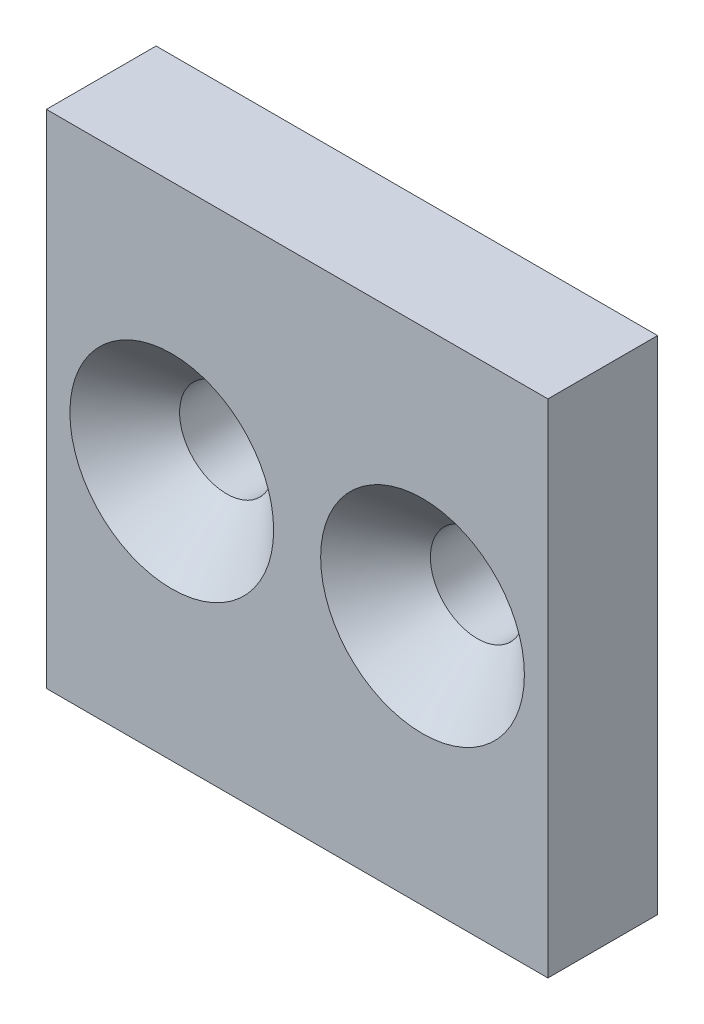
ISO-10303-21;
HEADER;
FILE_DESCRIPTION(('STEP AP214'),'2;1');
FILE_NAME('part.step','',(''),(''),'','','');
FILE_SCHEMA(('AUTOMOTIVE_DESIGN { 1 0 10303 214 1 1 1 1 }'));
ENDSEC;
DATA;
#1=APPLICATION_CONTEXT('core data for automotive mechanical design processes');
#2=APPLICATION_PROTOCOL_DEFINITION('international standard','automotive_design',2000,#1);
#3=PRODUCT_CONTEXT('',#1,'mechanical');
#4=PRODUCT('Part','Part','',(#3));
#5=PRODUCT_RELATED_PRODUCT_CATEGORY('part','',(#4));
#6=PRODUCT_DEFINITION_FORMATION('','',#4);
#7=PRODUCT_DEFINITION_CONTEXT('part definition',#1,'design');
#8=PRODUCT_DEFINITION('design','',#6,#7);
#9=PRODUCT_DEFINITION_SHAPE('','',#8);
#10=(LENGTH_UNIT() NAMED_UNIT(*) SI_UNIT(.MILLI.,.METRE.));
#11=(NAMED_UNIT(*) PLANE_ANGLE_UNIT() SI_UNIT($,.RADIAN.));
#12=(NAMED_UNIT(*) SI_UNIT($,.STERADIAN.) SOLID_ANGLE_UNIT());
#13=UNCERTAINTY_MEASURE_WITH_UNIT(LENGTH_MEASURE(1.E-05),#10,'distance_accuracy_value','');
#14=(GEOMETRIC_REPRESENTATION_CONTEXT(3) GLOBAL_UNCERTAINTY_ASSIGNED_CONTEXT((#13)) GLOBAL_UNIT_ASSIGNED_CONTEXT((#10,
#11,#12)) REPRESENTATION_CONTEXT('',''));
#15=CARTESIAN_POINT('',(0.,0.,0.));
#16=DIRECTION('',(0.,0.,1.));
#17=DIRECTION('',(1.,0.,0.));
#18=AXIS2_PLACEMENT_3D('',#15,#16,#17);
#19=CARTESIAN_POINT('',(22.8801756645573,4.7559127950948,7.));
#20=DIRECTION('',(1.,0.,0.));
#21=DIRECTION('',(0.,1.,0.));
#22=AXIS2_PLACEMENT_3D('',#19,#20,#21);
#23=PLANE('',#22);
#24=DIRECTION('',(0.,-1.,0.));
#25=VECTOR('',#24,1.);
#26=CARTESIAN_POINT('',(22.8801756645573,4.7559127950948,0.));
#27=LINE('',#26,#25);
#28=CARTESIAN_POINT('',(22.8801756645573,4.7559127950948,0.));
#29=VERTEX_POINT('',#28);
#30=CARTESIAN_POINT('',(22.8801756645573,-27.244087204905,0.));
#31=VERTEX_POINT('',#30);
#32=EDGE_CURVE('E105',#29,#31,#27,.T.);
#33=ORIENTED_EDGE('',*,*,#32,.T.);
#34=DIRECTION('',(0.,0.,-1.));
#35=VECTOR('',#34,1.);
#36=CARTESIAN_POINT('',(22.8801756645573,-27.2440872049052,7.00000000000003));
#37=LINE('',#36,#35);
#38=CARTESIAN_POINT('',(22.8801756645573,-27.2440872049052,7.00000000000003));
#39=VERTEX_POINT('',#38);
#40=EDGE_CURVE('E11',#39,#31,#37,.T.);
#41=ORIENTED_EDGE('',*,*,#40,.F.);
#42=DIRECTION('',(0.,-1.,0.));
#43=VECTOR('',#42,1.);
#44=CARTESIAN_POINT('',(22.8801756645573,4.7559127950948,7.));
#45=LINE('',#44,#43);
#46=CARTESIAN_POINT('',(22.8801756645573,4.7559127950948,7.));
#47=VERTEX_POINT('',#46);
#48=EDGE_CURVE('E92',#47,#39,#45,.T.);
#49=ORIENTED_EDGE('',*,*,#48,.F.);
#50=DIRECTION('',(0.,0.,-1.));
#51=VECTOR('',#50,1.);
#52=CARTESIAN_POINT('',(22.8801756645573,4.7559127950948,7.));
#53=LINE('',#52,#51);
#54=EDGE_CURVE('E101',#47,#29,#53,.T.);
#55=ORIENTED_EDGE('',*,*,#54,.T.);
#56=EDGE_LOOP('',(#33,#41,#49,#55));
#57=FACE_BOUND('',#56,.T.);
#58=ADVANCED_FACE('F39',(#57),#23,.F.);
#59=CARTESIAN_POINT('',(22.8801756645573,-27.2440872049052,7.00000000000003));
#60=DIRECTION('',(0.,1.,0.));
#61=DIRECTION('',(0.,0.,1.));
#62=AXIS2_PLACEMENT_3D('',#59,#60,#61);
#63=PLANE('',#62);
#64=DIRECTION('',(1.,0.,0.));
#65=VECTOR('',#64,1.);
#66=CARTESIAN_POINT('',(22.8801756645573,-27.244087204905,0.));
#67=LINE('',#66,#65);
#68=CARTESIAN_POINT('',(54.8801756645573,-27.244087204905,0.));
#69=VERTEX_POINT('',#68);
#70=EDGE_CURVE('E96',#31,#69,#67,.T.);
#71=ORIENTED_EDGE('',*,*,#70,.T.);
#72=DIRECTION('',(0.,0.,-1.));
#73=VECTOR('',#72,1.);
#74=CARTESIAN_POINT('',(54.8801756645573,-27.2440872049052,7.00000000000003));
#75=LINE('',#74,#73);
#76=CARTESIAN_POINT('',(54.8801756645573,-27.2440872049052,7.00000000000003));
#77=VERTEX_POINT('',#76);
#78=EDGE_CURVE('E48',#77,#69,#75,.T.);
#79=ORIENTED_EDGE('',*,*,#78,.F.);
#80=DIRECTION('',(1.,0.,0.));
#81=VECTOR('',#80,1.);
#82=CARTESIAN_POINT('',(22.8801756645573,-27.2440872049052,7.00000000000003));
#83=LINE('',#82,#81);
#84=EDGE_CURVE('E87',#39,#77,#83,.T.);
#85=ORIENTED_EDGE('',*,*,#84,.F.);
#86=ORIENTED_EDGE('',*,*,#40,.T.);
#87=EDGE_LOOP('',(#71,#79,#85,#86));
#88=FACE_BOUND('',#87,.T.);
#89=ADVANCED_FACE('F95',(#88),#63,.F.);
#90=CARTESIAN_POINT('',(54.8801756645573,4.7559127950948,7.));
#91=DIRECTION('',(-1.,0.,0.));
#92=DIRECTION('',(0.,0.,1.));
#93=AXIS2_PLACEMENT_3D('',#90,#91,#92);
#94=PLANE('',#93);
#95=DIRECTION('',(0.,1.,0.));
#96=VECTOR('',#95,1.);
#97=CARTESIAN_POINT('',(54.8801756645573,4.7559127950948,0.));
#98=LINE('',#97,#96);
#99=CARTESIAN_POINT('',(54.8801756645573,4.7559127950948,0.));
#100=VERTEX_POINT('',#99);
#101=EDGE_CURVE('E74',#69,#100,#98,.T.);
#102=ORIENTED_EDGE('',*,*,#101,.T.);
#103=DIRECTION('',(0.,0.,-1.));
#104=VECTOR('',#103,1.);
#105=CARTESIAN_POINT('',(54.8801756645573,4.7559127950948,7.));
#106=LINE('',#105,#104);
#107=CARTESIAN_POINT('',(54.8801756645573,4.7559127950948,7.));
#108=VERTEX_POINT('',#107);
#109=EDGE_CURVE('E97',#108,#100,#106,.T.);
#110=ORIENTED_EDGE('',*,*,#109,.F.);
#111=DIRECTION('',(0.,1.,0.));
#112=VECTOR('',#111,1.);
#113=CARTESIAN_POINT('',(54.8801756645573,4.7559127950948,7.));
#114=LINE('',#113,#112);
#115=EDGE_CURVE('E90',#77,#108,#114,.T.);
#116=ORIENTED_EDGE('',*,*,#115,.F.);
#117=ORIENTED_EDGE('',*,*,#78,.T.);
#118=EDGE_LOOP('',(#102,#110,#116,#117));
#119=FACE_BOUND('',#118,.T.);
#120=ADVANCED_FACE('F99',(#119),#94,.F.);
#121=CARTESIAN_POINT('',(22.8801756645573,4.7559127950948,7.));
#122=DIRECTION('',(0.,-1.,0.));
#123=DIRECTION('',(0.,0.,-1.));
#124=AXIS2_PLACEMENT_3D('',#121,#122,#123);
#125=PLANE('',#124);
#126=DIRECTION('',(-1.,0.,0.));
#127=VECTOR('',#126,1.);
#128=CARTESIAN_POINT('',(22.8801756645573,4.7559127950948,0.));
#129=LINE('',#128,#127);
#130=EDGE_CURVE('E80',#100,#29,#129,.T.);
#131=ORIENTED_EDGE('',*,*,#130,.T.);
#132=ORIENTED_EDGE('',*,*,#54,.F.);
#133=DIRECTION('',(-1.,0.,0.));
#134=VECTOR('',#133,1.);
#135=CARTESIAN_POINT('',(22.8801756645573,4.7559127950948,7.));
#136=LINE('',#135,#134);
#137=EDGE_CURVE('E57',#108,#47,#136,.T.);
#138=ORIENTED_EDGE('',*,*,#137,.F.);
#139=ORIENTED_EDGE('',*,*,#109,.T.);
#140=EDGE_LOOP('',(#131,#132,#138,#139));
#141=FACE_BOUND('',#140,.T.);
#142=ADVANCED_FACE('F137',(#141),#125,.F.);
#143=CARTESIAN_POINT('',(0.,0.,7.));
#144=DIRECTION('',(0.,0.,1.));
#145=DIRECTION('',(1.,0.,0.));
#146=AXIS2_PLACEMENT_3D('',#143,#144,#145);
#147=PLANE('',#146);
#148=CARTESIAN_POINT('',(30.8801756645573,-11.2440872049052,7.));
#149=DIRECTION('',(0.,0.,1.));
#150=DIRECTION('',(1.,0.,0.));
#151=AXIS2_PLACEMENT_3D('',#148,#149,#150);
#152=CIRCLE('',#151,6.5);
#153=CARTESIAN_POINT('',(37.3801756645573,-11.2440872049052,7.));
#154=VERTEX_POINT('',#153);
#155=EDGE_CURVE('E128',#154,#154,#152,.T.);
#156=ORIENTED_EDGE('',*,*,#155,.F.);
#157=EDGE_LOOP('',(#156));
#158=FACE_BOUND('',#157,.T.);
#159=CARTESIAN_POINT('',(46.8801756645573,-11.2440872049052,7.));
#160=DIRECTION('',(0.,0.,1.));
#161=DIRECTION('',(1.,0.,0.));
#162=AXIS2_PLACEMENT_3D('',#159,#160,#161);
#163=CIRCLE('',#162,6.5);
#164=CARTESIAN_POINT('',(53.3801756645573,-11.2440872049052,7.));
#165=VERTEX_POINT('',#164);
#166=EDGE_CURVE('E118',#165,#165,#163,.T.);
#167=ORIENTED_EDGE('',*,*,#166,.F.);
#168=EDGE_LOOP('',(#167));
#169=FACE_BOUND('',#168,.T.);
#170=ORIENTED_EDGE('',*,*,#48,.T.);
#171=ORIENTED_EDGE('',*,*,#84,.T.);
#172=ORIENTED_EDGE('',*,*,#115,.T.);
#173=ORIENTED_EDGE('',*,*,#137,.T.);
#174=EDGE_LOOP('',(#170,#171,#172,#173));
#175=FACE_BOUND('',#174,.T.);
#176=ADVANCED_FACE('F88',(#158,#169,#175),#147,.T.);
#177=CARTESIAN_POINT('',(0.,0.,0.));
#178=DIRECTION('',(0.,0.,1.));
#179=DIRECTION('',(1.,0.,0.));
#180=AXIS2_PLACEMENT_3D('',#177,#178,#179);
#181=PLANE('',#180);
#182=CARTESIAN_POINT('',(30.8801756645573,-11.244087204905,0.));
#183=DIRECTION('',(0.,0.,1.));
#184=DIRECTION('',(1.,0.,0.));
#185=AXIS2_PLACEMENT_3D('',#182,#183,#184);
#186=CIRCLE('',#185,3.);
#187=CARTESIAN_POINT('',(33.8801756645573,-11.244087204905,0.));
#188=VERTEX_POINT('',#187);
#189=EDGE_CURVE('E42',#188,#188,#186,.T.);
#190=ORIENTED_EDGE('',*,*,#189,.T.);
#191=EDGE_LOOP('',(#190));
#192=FACE_BOUND('',#191,.T.);
#193=CARTESIAN_POINT('',(46.8801756645573,-11.244087204905,0.));
#194=DIRECTION('',(0.,0.,1.));
#195=DIRECTION('',(1.,0.,0.));
#196=AXIS2_PLACEMENT_3D('',#193,#194,#195);
#197=CIRCLE('',#196,3.);
#198=CARTESIAN_POINT('',(49.8801756645573,-11.244087204905,0.));
#199=VERTEX_POINT('',#198);
#200=EDGE_CURVE('E108',#199,#199,#197,.T.);
#201=ORIENTED_EDGE('',*,*,#200,.T.);
#202=EDGE_LOOP('',(#201));
#203=FACE_BOUND('',#202,.T.);
#204=ORIENTED_EDGE('',*,*,#32,.F.);
#205=ORIENTED_EDGE('',*,*,#130,.F.);
#206=ORIENTED_EDGE('',*,*,#101,.F.);
#207=ORIENTED_EDGE('',*,*,#70,.F.);
#208=EDGE_LOOP('',(#204,#205,#206,#207));
#209=FACE_BOUND('',#208,.T.);
#210=ADVANCED_FACE('F136',(#192,#203,#209),#181,.F.);
#211=CARTESIAN_POINT('',(46.8801756645573,-11.2440872049052,7.));
#212=DIRECTION('',(0.,0.,1.));
#213=DIRECTION('',(1.,0.,0.));
#214=AXIS2_PLACEMENT_3D('',#211,#212,#213);
#215=CYLINDRICAL_SURFACE('',#214,3.);
#216=CARTESIAN_POINT('',(46.8801756645573,-11.2440872049052,3.5));
#217=DIRECTION('',(0.,0.,1.));
#218=DIRECTION('',(1.,0.,0.));
#219=AXIS2_PLACEMENT_3D('',#216,#217,#218);
#220=CIRCLE('',#219,3.);
#221=CARTESIAN_POINT('',(49.8801756645573,-11.2440872049052,3.5));
#222=VERTEX_POINT('',#221);
#223=EDGE_CURVE('E114',#222,#222,#220,.T.);
#224=ORIENTED_EDGE('',*,*,#223,.T.);
#225=EDGE_LOOP('',(#224));
#226=FACE_BOUND('',#225,.T.);
#227=ORIENTED_EDGE('',*,*,#200,.F.);
#228=EDGE_LOOP('',(#227));
#229=FACE_BOUND('',#228,.T.);
#230=ADVANCED_FACE('F144',(#226,#229),#215,.F.);
#231=CARTESIAN_POINT('',(46.8801756645573,-11.2440872049052,7.));
#232=DIRECTION('',(0.,0.,1.));
#233=DIRECTION('',(1.,0.,0.));
#234=AXIS2_PLACEMENT_3D('',#231,#232,#233);
#235=CONICAL_SURFACE('',#234,6.5,0.785398163397448);
#236=ORIENTED_EDGE('',*,*,#223,.F.);
#237=EDGE_LOOP('',(#236));
#238=FACE_BOUND('',#237,.T.);
#239=ORIENTED_EDGE('',*,*,#166,.T.);
#240=EDGE_LOOP('',(#239));
#241=FACE_BOUND('',#240,.T.);
#242=ADVANCED_FACE('F141',(#238,#241),#235,.F.);
#243=CARTESIAN_POINT('',(30.8801756645573,-11.2440872049052,7.));
#244=DIRECTION('',(0.,0.,1.));
#245=DIRECTION('',(1.,0.,0.));
#246=AXIS2_PLACEMENT_3D('',#243,#244,#245);
#247=CYLINDRICAL_SURFACE('',#246,3.);
#248=CARTESIAN_POINT('',(30.8801756645573,-11.2440872049052,3.5));
#249=DIRECTION('',(0.,0.,1.));
#250=DIRECTION('',(1.,0.,0.));
#251=AXIS2_PLACEMENT_3D('',#248,#249,#250);
#252=CIRCLE('',#251,3.);
#253=CARTESIAN_POINT('',(33.8801756645573,-11.2440872049052,3.5));
#254=VERTEX_POINT('',#253);
#255=EDGE_CURVE('E125',#254,#254,#252,.T.);
#256=ORIENTED_EDGE('',*,*,#255,.T.);
#257=EDGE_LOOP('',(#256));
#258=FACE_BOUND('',#257,.T.);
#259=ORIENTED_EDGE('',*,*,#189,.F.);
#260=EDGE_LOOP('',(#259));
#261=FACE_BOUND('',#260,.T.);
#262=ADVANCED_FACE('F143',(#258,#261),#247,.F.);
#263=CARTESIAN_POINT('',(30.8801756645573,-11.2440872049052,7.));
#264=DIRECTION('',(0.,0.,1.));
#265=DIRECTION('',(1.,0.,0.));
#266=AXIS2_PLACEMENT_3D('',#263,#264,#265);
#267=CONICAL_SURFACE('',#266,6.5,0.785398163397448);
#268=ORIENTED_EDGE('',*,*,#255,.F.);
#269=EDGE_LOOP('',(#268));
#270=FACE_BOUND('',#269,.T.);
#271=ORIENTED_EDGE('',*,*,#155,.T.);
#272=EDGE_LOOP('',(#271));
#273=FACE_BOUND('',#272,.T.);
#274=ADVANCED_FACE('F132',(#270,#273),#267,.F.);
#275=CLOSED_SHELL('',(#58,#89,#120,#142,#176,#210,#230,#242,#262,#274));
#276=MANIFOLD_SOLID_BREP('B2',#275);
#277=ADVANCED_BREP_SHAPE_REPRESENTATION('',(#18,#276),#14);
#278=SHAPE_DEFINITION_REPRESENTATION(#9,#277);
ENDSEC;
END-ISO-10303-21;
